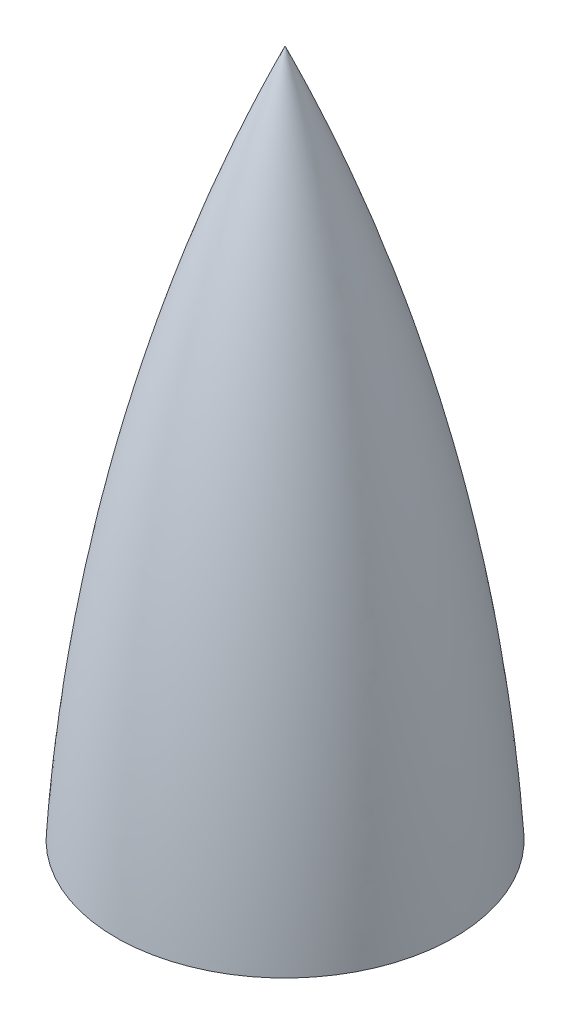
ISO-10303-21;
HEADER;
FILE_DESCRIPTION(('STEP AP214'),'2;1');
FILE_NAME('part.step','',(''),(''),'','','');
FILE_SCHEMA(('AUTOMOTIVE_DESIGN { 1 0 10303 214 1 1 1 1 }'));
ENDSEC;
DATA;
#1=APPLICATION_CONTEXT('core data for automotive mechanical design processes');
#2=APPLICATION_PROTOCOL_DEFINITION('international standard','automotive_design',2000,#1);
#3=PRODUCT_CONTEXT('',#1,'mechanical');
#4=PRODUCT('Part','Part','',(#3));
#5=PRODUCT_RELATED_PRODUCT_CATEGORY('part','',(#4));
#6=PRODUCT_DEFINITION_FORMATION('','',#4);
#7=PRODUCT_DEFINITION_CONTEXT('part definition',#1,'design');
#8=PRODUCT_DEFINITION('design','',#6,#7);
#9=PRODUCT_DEFINITION_SHAPE('','',#8);
#10=(LENGTH_UNIT() NAMED_UNIT(*) SI_UNIT(.MILLI.,.METRE.));
#11=(NAMED_UNIT(*) PLANE_ANGLE_UNIT() SI_UNIT($,.RADIAN.));
#12=(NAMED_UNIT(*) SI_UNIT($,.STERADIAN.) SOLID_ANGLE_UNIT());
#13=UNCERTAINTY_MEASURE_WITH_UNIT(LENGTH_MEASURE(1.E-05),#10,'distance_accuracy_value','');
#14=(GEOMETRIC_REPRESENTATION_CONTEXT(3) GLOBAL_UNCERTAINTY_ASSIGNED_CONTEXT((#13)) GLOBAL_UNIT_ASSIGNED_CONTEXT((#10,
#11,#12)) REPRESENTATION_CONTEXT('',''));
#15=CARTESIAN_POINT('',(0.,0.,0.));
#16=DIRECTION('',(0.,0.,1.));
#17=DIRECTION('',(1.,0.,0.));
#18=AXIS2_PLACEMENT_3D('',#15,#16,#17);
#19=CARTESIAN_POINT('',(997.702355629933,-66.2447994338374,0.));
#20=DIRECTION('',(0.,0.,-1.));
#21=DIRECTION('',(-1.,0.,0.));
#22=AXIS2_PLACEMENT_3D('',#19,#20,#21);
#23=CIRCLE('',#22,1093.36082838655);
#24=TRIMMED_CURVE('',#23,(PARAMETER_VALUE(-0.421418302087113)),
(PARAMETER_VALUE(0.421418302087113)),.T.,.PARAMETER.);
#25=CARTESIAN_POINT('',(-7.7715611723761E-13,-66.2447994338357,0.));
#26=DIRECTION('',(0.,1.,0.));
#27=AXIS1_PLACEMENT('',#25,#26);
#28=SURFACE_OF_REVOLUTION('',#24,#27);
#29=CARTESIAN_POINT('',(-6.53226602665202E-13,-1.66533453693773E-13,0.));
#30=DIRECTION('',(0.,1.,0.));
#31=DIRECTION('',(-1.,0.,0.));
#32=AXIS2_PLACEMENT_3D('',#29,#30,#31);
#33=CIRCLE('',#32,93.6497999999993);
#34=CARTESIAN_POINT('',(-93.6498,0.,0.));
#35=VERTEX_POINT('',#34);
#36=EDGE_CURVE('E11',#35,#35,#33,.T.);
#37=ORIENTED_EDGE('',*,*,#36,.T.);
#38=EDGE_LOOP('',(#37));
#39=FACE_BOUND('',#38,.T.);
#40=CARTESIAN_POINT('',(0.,381.,0.));
#41=VERTEX_POINT('',#40);
#42=VERTEX_LOOP('',#41);
#43=FACE_BOUND('',#42,.T.);
#44=ADVANCED_FACE('F45',(#39,#43),#28,.T.);
#45=CARTESIAN_POINT('',(-93.6498,-1.27767205017624E-13,0.));
#46=DIRECTION('',(0.,-1.,0.));
#47=DIRECTION('',(1.,0.,0.));
#48=AXIS2_PLACEMENT_3D('',#45,#46,#47);
#49=PLANE('',#48);
#50=CARTESIAN_POINT('',(-6.53226602665202E-13,-4.44089209850063E-13,0.));
#51=DIRECTION('',(0.,1.,0.));
#52=DIRECTION('',(-1.,0.,0.));
#53=AXIS2_PLACEMENT_3D('',#50,#51,#52);
#54=CIRCLE('',#53,88.8999999999993);
#55=CARTESIAN_POINT('',(-88.9,-2.91669669228183E-13,0.));
#56=VERTEX_POINT('',#55);
#57=EDGE_CURVE('E52',#56,#56,#54,.T.);
#58=ORIENTED_EDGE('',*,*,#57,.T.);
#59=EDGE_LOOP('',(#58));
#60=FACE_BOUND('',#59,.T.);
#61=ORIENTED_EDGE('',*,*,#36,.F.);
#62=EDGE_LOOP('',(#61));
#63=FACE_BOUND('',#62,.T.);
#64=ADVANCED_FACE('F61',(#60,#63),#49,.T.);
#65=CARTESIAN_POINT('',(1114.6957846476,-86.1623139369334,0.));
#66=DIRECTION('',(0.,0.,-1.));
#67=DIRECTION('',(-1.,0.,0.));
#68=AXIS2_PLACEMENT_3D('',#65,#66,#67);
#69=CIRCLE('',#68,1206.67591223346);
#70=TRIMMED_CURVE('',#69,(PARAMETER_VALUE(-0.392974866829419)),
(PARAMETER_VALUE(0.392974866829419)),.T.,.PARAMETER.);
#71=CARTESIAN_POINT('',(-8.88178419700125E-13,-86.1623139369315,0.));
#72=DIRECTION('',(0.,1.,0.));
#73=AXIS1_PLACEMENT('',#71,#72);
#74=SURFACE_OF_REVOLUTION('',#70,#73);
#75=CARTESIAN_POINT('',(0.,375.92,0.));
#76=VERTEX_POINT('',#75);
#77=VERTEX_LOOP('',#76);
#78=FACE_BOUND('',#77,.T.);
#79=ORIENTED_EDGE('',*,*,#57,.F.);
#80=EDGE_LOOP('',(#79));
#81=FACE_BOUND('',#80,.T.);
#82=ADVANCED_FACE('F58',(#78,#81),#74,.F.);
#83=CLOSED_SHELL('',(#44,#64,#82));
#84=MANIFOLD_SOLID_BREP('B2',#83);
#85=ADVANCED_BREP_SHAPE_REPRESENTATION('',(#18,#84),#14);
#86=SHAPE_DEFINITION_REPRESENTATION(#9,#85);
ENDSEC;
END-ISO-10303-21;
